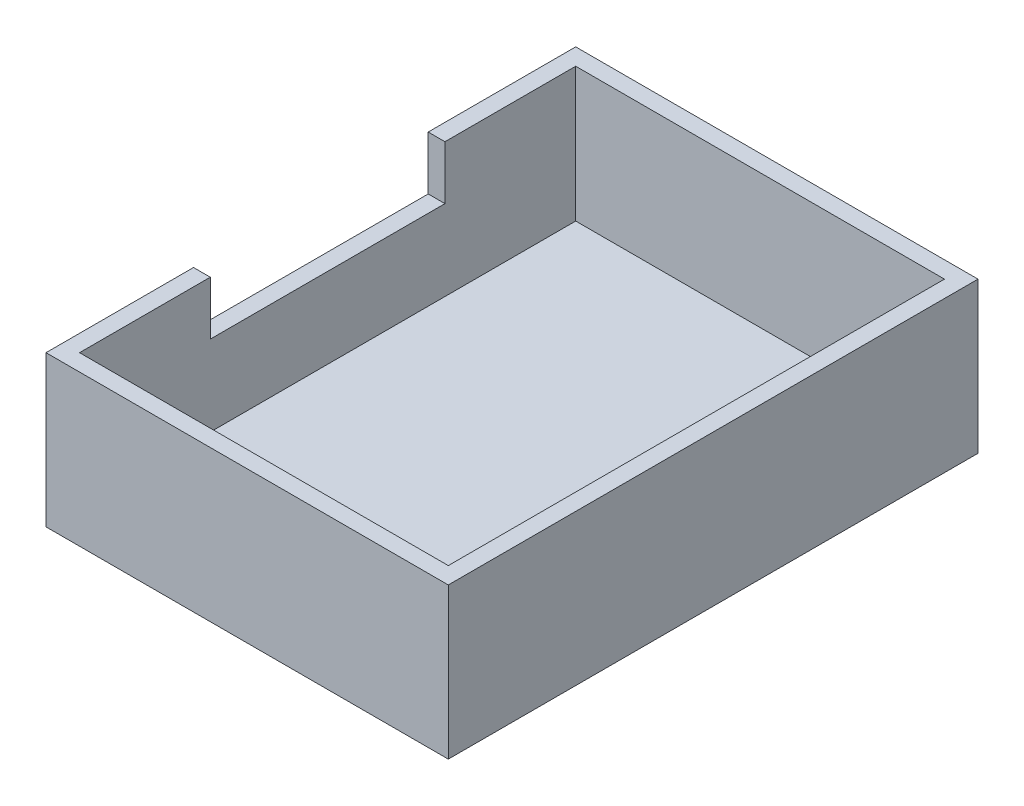
ISO-10303-21;
HEADER;
FILE_DESCRIPTION(('STEP AP214'),'2;1');
FILE_NAME('part.step','',(''),(''),'','','');
FILE_SCHEMA(('AUTOMOTIVE_DESIGN { 1 0 10303 214 1 1 1 1 }'));
ENDSEC;
DATA;
#1=APPLICATION_CONTEXT('core data for automotive mechanical design processes');
#2=APPLICATION_PROTOCOL_DEFINITION('international standard','automotive_design',2000,#1);
#3=PRODUCT_CONTEXT('',#1,'mechanical');
#4=PRODUCT('Part','Part','',(#3));
#5=PRODUCT_RELATED_PRODUCT_CATEGORY('part','',(#4));
#6=PRODUCT_DEFINITION_FORMATION('','',#4);
#7=PRODUCT_DEFINITION_CONTEXT('part definition',#1,'design');
#8=PRODUCT_DEFINITION('design','',#6,#7);
#9=PRODUCT_DEFINITION_SHAPE('','',#8);
#10=(LENGTH_UNIT() NAMED_UNIT(*) SI_UNIT(.MILLI.,.METRE.));
#11=(NAMED_UNIT(*) PLANE_ANGLE_UNIT() SI_UNIT($,.RADIAN.));
#12=(NAMED_UNIT(*) SI_UNIT($,.STERADIAN.) SOLID_ANGLE_UNIT());
#13=UNCERTAINTY_MEASURE_WITH_UNIT(LENGTH_MEASURE(1.E-05),#10,'distance_accuracy_value','');
#14=(GEOMETRIC_REPRESENTATION_CONTEXT(3) GLOBAL_UNCERTAINTY_ASSIGNED_CONTEXT((#13)) GLOBAL_UNIT_ASSIGNED_CONTEXT((#10,
#11,#12)) REPRESENTATION_CONTEXT('',''));
#15=CARTESIAN_POINT('',(0.,0.,0.));
#16=DIRECTION('',(0.,0.,1.));
#17=DIRECTION('',(1.,0.,0.));
#18=AXIS2_PLACEMENT_3D('',#15,#16,#17);
#19=CARTESIAN_POINT('',(0.,40.,0.));
#20=DIRECTION('',(0.,-1.,0.));
#21=DIRECTION('',(0.,0.,-1.));
#22=AXIS2_PLACEMENT_3D('',#19,#20,#21);
#23=PLANE('',#22);
#24=DIRECTION('',(0.,0.,1.));
#25=VECTOR('',#24,1.);
#26=CARTESIAN_POINT('',(-55.,40.,74.));
#27=LINE('',#26,#25);
#28=CARTESIAN_POINT('',(-55.,40.,35.));
#29=VERTEX_POINT('',#28);
#30=CARTESIAN_POINT('',(-55.,40.,74.));
#31=VERTEX_POINT('',#30);
#32=EDGE_CURVE('E71',#29,#31,#27,.T.);
#33=ORIENTED_EDGE('',*,*,#32,.F.);
#34=DIRECTION('',(1.,0.,0.));
#35=VECTOR('',#34,1.);
#36=CARTESIAN_POINT('',(-60.,40.,35.));
#37=LINE('',#36,#35);
#38=CARTESIAN_POINT('',(-60.,40.,35.));
#39=VERTEX_POINT('',#38);
#40=EDGE_CURVE('E136',#39,#29,#37,.T.);
#41=ORIENTED_EDGE('',*,*,#40,.F.);
#42=DIRECTION('',(0.,0.,1.));
#43=VECTOR('',#42,1.);
#44=CARTESIAN_POINT('',(-60.,40.,79.));
#45=LINE('',#44,#43);
#46=CARTESIAN_POINT('',(-60.,40.,79.));
#47=VERTEX_POINT('',#46);
#48=EDGE_CURVE('E200',#39,#47,#45,.T.);
#49=ORIENTED_EDGE('',*,*,#48,.T.);
#50=DIRECTION('',(1.,0.,0.));
#51=VECTOR('',#50,1.);
#52=CARTESIAN_POINT('',(-60.,40.,79.));
#53=LINE('',#52,#51);
#54=CARTESIAN_POINT('',(60.,40.,79.));
#55=VERTEX_POINT('',#54);
#56=EDGE_CURVE('E205',#47,#55,#53,.T.);
#57=ORIENTED_EDGE('',*,*,#56,.T.);
#58=DIRECTION('',(0.,0.,-1.));
#59=VECTOR('',#58,1.);
#60=CARTESIAN_POINT('',(60.,40.,79.));
#61=LINE('',#60,#59);
#62=CARTESIAN_POINT('',(60.,40.,-79.));
#63=VERTEX_POINT('',#62);
#64=EDGE_CURVE('E208',#55,#63,#61,.T.);
#65=ORIENTED_EDGE('',*,*,#64,.T.);
#66=DIRECTION('',(-1.,0.,0.));
#67=VECTOR('',#66,1.);
#68=CARTESIAN_POINT('',(-60.,40.,-79.));
#69=LINE('',#68,#67);
#70=CARTESIAN_POINT('',(-60.,40.,-79.));
#71=VERTEX_POINT('',#70);
#72=EDGE_CURVE('E211',#63,#71,#69,.T.);
#73=ORIENTED_EDGE('',*,*,#72,.T.);
#74=CARTESIAN_POINT('',(-60.,40.,-35.));
#75=VERTEX_POINT('',#74);
#76=EDGE_CURVE('E201',#71,#75,#45,.T.);
#77=ORIENTED_EDGE('',*,*,#76,.T.);
#78=DIRECTION('',(-1.,0.,0.));
#79=VECTOR('',#78,1.);
#80=CARTESIAN_POINT('',(-55.,40.,-35.));
#81=LINE('',#80,#79);
#82=CARTESIAN_POINT('',(-55.,40.,-35.));
#83=VERTEX_POINT('',#82);
#84=EDGE_CURVE('E143',#83,#75,#81,.T.);
#85=ORIENTED_EDGE('',*,*,#84,.F.);
#86=CARTESIAN_POINT('',(-55.,40.,-74.));
#87=VERTEX_POINT('',#86);
#88=EDGE_CURVE('E157',#87,#83,#27,.T.);
#89=ORIENTED_EDGE('',*,*,#88,.F.);
#90=DIRECTION('',(-1.,0.,0.));
#91=VECTOR('',#90,1.);
#92=CARTESIAN_POINT('',(-55.,40.,-74.));
#93=LINE('',#92,#91);
#94=CARTESIAN_POINT('',(55.,40.,-74.));
#95=VERTEX_POINT('',#94);
#96=EDGE_CURVE('E158',#95,#87,#93,.T.);
#97=ORIENTED_EDGE('',*,*,#96,.F.);
#98=DIRECTION('',(0.,0.,-1.));
#99=VECTOR('',#98,1.);
#100=CARTESIAN_POINT('',(55.,40.,74.));
#101=LINE('',#100,#99);
#102=CARTESIAN_POINT('',(55.,40.,74.));
#103=VERTEX_POINT('',#102);
#104=EDGE_CURVE('E163',#103,#95,#101,.T.);
#105=ORIENTED_EDGE('',*,*,#104,.F.);
#106=DIRECTION('',(1.,0.,0.));
#107=VECTOR('',#106,1.);
#108=CARTESIAN_POINT('',(-55.,40.,74.));
#109=LINE('',#108,#107);
#110=EDGE_CURVE('E155',#31,#103,#109,.T.);
#111=ORIENTED_EDGE('',*,*,#110,.F.);
#112=EDGE_LOOP('',(#33,#41,#49,#57,#65,#73,#77,#85,#89,#97,#105,#111));
#113=FACE_BOUND('',#112,.T.);
#114=ADVANCED_FACE('F48',(#113),#23,.F.);
#115=CARTESIAN_POINT('',(-60.,40.,79.));
#116=DIRECTION('',(1.,0.,0.));
#117=DIRECTION('',(0.,0.,-1.));
#118=AXIS2_PLACEMENT_3D('',#115,#116,#117);
#119=PLANE('',#118);
#120=ORIENTED_EDGE('',*,*,#48,.F.);
#121=DIRECTION('',(0.,1.,0.));
#122=VECTOR('',#121,1.);
#123=CARTESIAN_POINT('',(-60.,-70.178344238091,35.));
#124=LINE('',#123,#122);
#125=CARTESIAN_POINT('',(-60.,24.,35.));
#126=VERTEX_POINT('',#125);
#127=EDGE_CURVE('E139',#126,#39,#124,.T.);
#128=ORIENTED_EDGE('',*,*,#127,.F.);
#129=DIRECTION('',(0.,0.,-1.));
#130=VECTOR('',#129,1.);
#131=CARTESIAN_POINT('',(-60.,24.,-35.));
#132=LINE('',#131,#130);
#133=CARTESIAN_POINT('',(-60.,24.,-35.));
#134=VERTEX_POINT('',#133);
#135=EDGE_CURVE('E392',#126,#134,#132,.T.);
#136=ORIENTED_EDGE('',*,*,#135,.T.);
#137=DIRECTION('',(0.,1.,0.));
#138=VECTOR('',#137,1.);
#139=CARTESIAN_POINT('',(-60.,-70.178344238091,-35.));
#140=LINE('',#139,#138);
#141=EDGE_CURVE('E407',#134,#75,#140,.T.);
#142=ORIENTED_EDGE('',*,*,#141,.T.);
#143=ORIENTED_EDGE('',*,*,#76,.F.);
#144=DIRECTION('',(0.,-1.,0.));
#145=VECTOR('',#144,1.);
#146=CARTESIAN_POINT('',(-60.,40.,-79.));
#147=LINE('',#146,#145);
#148=CARTESIAN_POINT('',(-60.,-5.,-79.));
#149=VERTEX_POINT('',#148);
#150=EDGE_CURVE('E214',#71,#149,#147,.T.);
#151=ORIENTED_EDGE('',*,*,#150,.T.);
#152=DIRECTION('',(0.,0.,-1.));
#153=VECTOR('',#152,1.);
#154=CARTESIAN_POINT('',(-60.,-5.,-79.));
#155=LINE('',#154,#153);
#156=CARTESIAN_POINT('',(-60.,-5.,79.));
#157=VERTEX_POINT('',#156);
#158=EDGE_CURVE('E397',#157,#149,#155,.T.);
#159=ORIENTED_EDGE('',*,*,#158,.F.);
#160=DIRECTION('',(0.,-1.,0.));
#161=VECTOR('',#160,1.);
#162=CARTESIAN_POINT('',(-60.,40.,79.));
#163=LINE('',#162,#161);
#164=EDGE_CURVE('E13',#47,#157,#163,.T.);
#165=ORIENTED_EDGE('',*,*,#164,.F.);
#166=EDGE_LOOP('',(#120,#128,#136,#142,#143,#151,#159,#165));
#167=FACE_BOUND('',#166,.T.);
#168=ADVANCED_FACE('F50',(#167),#119,.F.);
#169=CARTESIAN_POINT('',(-60.,40.,79.));
#170=DIRECTION('',(0.,0.,-1.));
#171=DIRECTION('',(-1.,0.,0.));
#172=AXIS2_PLACEMENT_3D('',#169,#170,#171);
#173=PLANE('',#172);
#174=ORIENTED_EDGE('',*,*,#164,.T.);
#175=DIRECTION('',(-1.,0.,0.));
#176=VECTOR('',#175,1.);
#177=CARTESIAN_POINT('',(-60.,-5.,79.));
#178=LINE('',#177,#176);
#179=CARTESIAN_POINT('',(60.,-5.,79.));
#180=VERTEX_POINT('',#179);
#181=EDGE_CURVE('E175',#180,#157,#178,.T.);
#182=ORIENTED_EDGE('',*,*,#181,.F.);
#183=DIRECTION('',(0.,-1.,0.));
#184=VECTOR('',#183,1.);
#185=CARTESIAN_POINT('',(60.,40.,79.));
#186=LINE('',#185,#184);
#187=EDGE_CURVE('E57',#55,#180,#186,.T.);
#188=ORIENTED_EDGE('',*,*,#187,.F.);
#189=ORIENTED_EDGE('',*,*,#56,.F.);
#190=EDGE_LOOP('',(#174,#182,#188,#189));
#191=FACE_BOUND('',#190,.T.);
#192=ADVANCED_FACE('F241',(#191),#173,.F.);
#193=CARTESIAN_POINT('',(60.,40.,79.));
#194=DIRECTION('',(-1.,0.,0.));
#195=DIRECTION('',(0.,0.,1.));
#196=AXIS2_PLACEMENT_3D('',#193,#194,#195);
#197=PLANE('',#196);
#198=ORIENTED_EDGE('',*,*,#187,.T.);
#199=DIRECTION('',(0.,0.,1.));
#200=VECTOR('',#199,1.);
#201=CARTESIAN_POINT('',(60.,-5.,79.));
#202=LINE('',#201,#200);
#203=CARTESIAN_POINT('',(60.,-5.,-79.));
#204=VERTEX_POINT('',#203);
#205=EDGE_CURVE('E227',#204,#180,#202,.T.);
#206=ORIENTED_EDGE('',*,*,#205,.F.);
#207=DIRECTION('',(0.,-1.,0.));
#208=VECTOR('',#207,1.);
#209=CARTESIAN_POINT('',(60.,40.,-79.));
#210=LINE('',#209,#208);
#211=EDGE_CURVE('E217',#63,#204,#210,.T.);
#212=ORIENTED_EDGE('',*,*,#211,.F.);
#213=ORIENTED_EDGE('',*,*,#64,.F.);
#214=EDGE_LOOP('',(#198,#206,#212,#213));
#215=FACE_BOUND('',#214,.T.);
#216=ADVANCED_FACE('F225',(#215),#197,.F.);
#217=CARTESIAN_POINT('',(-60.,40.,-79.));
#218=DIRECTION('',(0.,0.,1.));
#219=DIRECTION('',(1.,0.,0.));
#220=AXIS2_PLACEMENT_3D('',#217,#218,#219);
#221=PLANE('',#220);
#222=ORIENTED_EDGE('',*,*,#211,.T.);
#223=DIRECTION('',(1.,0.,0.));
#224=VECTOR('',#223,1.);
#225=CARTESIAN_POINT('',(60.,-5.,-79.));
#226=LINE('',#225,#224);
#227=EDGE_CURVE('E238',#149,#204,#226,.T.);
#228=ORIENTED_EDGE('',*,*,#227,.F.);
#229=ORIENTED_EDGE('',*,*,#150,.F.);
#230=ORIENTED_EDGE('',*,*,#72,.F.);
#231=EDGE_LOOP('',(#222,#228,#229,#230));
#232=FACE_BOUND('',#231,.T.);
#233=ADVANCED_FACE('F281',(#232),#221,.F.);
#234=CARTESIAN_POINT('',(55.,40.,74.));
#235=DIRECTION('',(-1.,0.,0.));
#236=DIRECTION('',(0.,0.,1.));
#237=AXIS2_PLACEMENT_3D('',#234,#235,#236);
#238=PLANE('',#237);
#239=DIRECTION('',(0.,0.,-1.));
#240=VECTOR('',#239,1.);
#241=CARTESIAN_POINT('',(55.,0.,74.));
#242=LINE('',#241,#240);
#243=CARTESIAN_POINT('',(55.,0.,74.));
#244=VERTEX_POINT('',#243);
#245=CARTESIAN_POINT('',(55.,0.,-74.));
#246=VERTEX_POINT('',#245);
#247=EDGE_CURVE('E170',#244,#246,#242,.T.);
#248=ORIENTED_EDGE('',*,*,#247,.F.);
#249=DIRECTION('',(0.,-1.,0.));
#250=VECTOR('',#249,1.);
#251=CARTESIAN_POINT('',(55.,40.,74.));
#252=LINE('',#251,#250);
#253=EDGE_CURVE('E169',#103,#244,#252,.T.);
#254=ORIENTED_EDGE('',*,*,#253,.F.);
#255=ORIENTED_EDGE('',*,*,#104,.T.);
#256=DIRECTION('',(0.,-1.,0.));
#257=VECTOR('',#256,1.);
#258=CARTESIAN_POINT('',(55.,40.,-74.));
#259=LINE('',#258,#257);
#260=EDGE_CURVE('E196',#95,#246,#259,.T.);
#261=ORIENTED_EDGE('',*,*,#260,.T.);
#262=EDGE_LOOP('',(#248,#254,#255,#261));
#263=FACE_BOUND('',#262,.T.);
#264=ADVANCED_FACE('F250',(#263),#238,.T.);
#265=CARTESIAN_POINT('',(-55.,40.,-74.));
#266=DIRECTION('',(0.,0.,1.));
#267=DIRECTION('',(1.,0.,0.));
#268=AXIS2_PLACEMENT_3D('',#265,#266,#267);
#269=PLANE('',#268);
#270=DIRECTION('',(-1.,0.,0.));
#271=VECTOR('',#270,1.);
#272=CARTESIAN_POINT('',(-55.,0.,-74.));
#273=LINE('',#272,#271);
#274=CARTESIAN_POINT('',(-55.,0.,-74.));
#275=VERTEX_POINT('',#274);
#276=EDGE_CURVE('E174',#246,#275,#273,.T.);
#277=ORIENTED_EDGE('',*,*,#276,.F.);
#278=ORIENTED_EDGE('',*,*,#260,.F.);
#279=ORIENTED_EDGE('',*,*,#96,.T.);
#280=DIRECTION('',(0.,-1.,0.));
#281=VECTOR('',#280,1.);
#282=CARTESIAN_POINT('',(-55.,40.,-74.));
#283=LINE('',#282,#281);
#284=EDGE_CURVE('E193',#87,#275,#283,.T.);
#285=ORIENTED_EDGE('',*,*,#284,.T.);
#286=EDGE_LOOP('',(#277,#278,#279,#285));
#287=FACE_BOUND('',#286,.T.);
#288=ADVANCED_FACE('F253',(#287),#269,.T.);
#289=CARTESIAN_POINT('',(-55.,40.,74.));
#290=DIRECTION('',(1.,0.,0.));
#291=DIRECTION('',(0.,0.,-1.));
#292=AXIS2_PLACEMENT_3D('',#289,#290,#291);
#293=PLANE('',#292);
#294=DIRECTION('',(0.,1.,0.));
#295=VECTOR('',#294,1.);
#296=CARTESIAN_POINT('',(-55.,-70.178344238091,35.));
#297=LINE('',#296,#295);
#298=CARTESIAN_POINT('',(-55.,24.,35.));
#299=VERTEX_POINT('',#298);
#300=EDGE_CURVE('E64',#299,#29,#297,.T.);
#301=ORIENTED_EDGE('',*,*,#300,.T.);
#302=ORIENTED_EDGE('',*,*,#32,.T.);
#303=DIRECTION('',(0.,-1.,0.));
#304=VECTOR('',#303,1.);
#305=CARTESIAN_POINT('',(-55.,40.,74.));
#306=LINE('',#305,#304);
#307=CARTESIAN_POINT('',(-55.,0.,74.));
#308=VERTEX_POINT('',#307);
#309=EDGE_CURVE('E190',#31,#308,#306,.T.);
#310=ORIENTED_EDGE('',*,*,#309,.T.);
#311=DIRECTION('',(0.,0.,1.));
#312=VECTOR('',#311,1.);
#313=CARTESIAN_POINT('',(-55.,0.,74.));
#314=LINE('',#313,#312);
#315=EDGE_CURVE('E179',#275,#308,#314,.T.);
#316=ORIENTED_EDGE('',*,*,#315,.F.);
#317=ORIENTED_EDGE('',*,*,#284,.F.);
#318=ORIENTED_EDGE('',*,*,#88,.T.);
#319=DIRECTION('',(0.,1.,0.));
#320=VECTOR('',#319,1.);
#321=CARTESIAN_POINT('',(-55.,-70.178344238091,-35.));
#322=LINE('',#321,#320);
#323=CARTESIAN_POINT('',(-55.,24.,-35.));
#324=VERTEX_POINT('',#323);
#325=EDGE_CURVE('E151',#324,#83,#322,.T.);
#326=ORIENTED_EDGE('',*,*,#325,.F.);
#327=DIRECTION('',(0.,0.,1.));
#328=VECTOR('',#327,1.);
#329=CARTESIAN_POINT('',(-55.,24.,35.));
#330=LINE('',#329,#328);
#331=EDGE_CURVE('E149',#324,#299,#330,.T.);
#332=ORIENTED_EDGE('',*,*,#331,.T.);
#333=EDGE_LOOP('',(#301,#302,#310,#316,#317,#318,#326,#332));
#334=FACE_BOUND('',#333,.T.);
#335=ADVANCED_FACE('F146',(#334),#293,.T.);
#336=CARTESIAN_POINT('',(-55.,40.,74.));
#337=DIRECTION('',(0.,0.,-1.));
#338=DIRECTION('',(-1.,0.,0.));
#339=AXIS2_PLACEMENT_3D('',#336,#337,#338);
#340=PLANE('',#339);
#341=DIRECTION('',(1.,0.,0.));
#342=VECTOR('',#341,1.);
#343=CARTESIAN_POINT('',(-55.,0.,74.));
#344=LINE('',#343,#342);
#345=EDGE_CURVE('E183',#308,#244,#344,.T.);
#346=ORIENTED_EDGE('',*,*,#345,.F.);
#347=ORIENTED_EDGE('',*,*,#309,.F.);
#348=ORIENTED_EDGE('',*,*,#110,.T.);
#349=ORIENTED_EDGE('',*,*,#253,.T.);
#350=EDGE_LOOP('',(#346,#347,#348,#349));
#351=FACE_BOUND('',#350,.T.);
#352=ADVANCED_FACE('F261',(#351),#340,.T.);
#353=CARTESIAN_POINT('',(0.,0.,0.));
#354=DIRECTION('',(0.,1.,0.));
#355=DIRECTION('',(0.,0.,1.));
#356=AXIS2_PLACEMENT_3D('',#353,#354,#355);
#357=PLANE('',#356);
#358=ORIENTED_EDGE('',*,*,#315,.T.);
#359=ORIENTED_EDGE('',*,*,#345,.T.);
#360=ORIENTED_EDGE('',*,*,#247,.T.);
#361=ORIENTED_EDGE('',*,*,#276,.T.);
#362=EDGE_LOOP('',(#358,#359,#360,#361));
#363=FACE_BOUND('',#362,.T.);
#364=ADVANCED_FACE('F259',(#363),#357,.T.);
#365=CARTESIAN_POINT('',(0.,-5.,0.));
#366=DIRECTION('',(0.,1.,0.));
#367=DIRECTION('',(0.,0.,1.));
#368=AXIS2_PLACEMENT_3D('',#365,#366,#367);
#369=PLANE('',#368);
#370=ORIENTED_EDGE('',*,*,#158,.T.);
#371=ORIENTED_EDGE('',*,*,#227,.T.);
#372=ORIENTED_EDGE('',*,*,#205,.T.);
#373=ORIENTED_EDGE('',*,*,#181,.T.);
#374=EDGE_LOOP('',(#370,#371,#372,#373));
#375=FACE_BOUND('',#374,.T.);
#376=ADVANCED_FACE('F235',(#375),#369,.F.);
#377=CARTESIAN_POINT('',(-60.,-70.178344238091,35.));
#378=DIRECTION('',(0.,0.,1.));
#379=DIRECTION('',(1.,0.,0.));
#380=AXIS2_PLACEMENT_3D('',#377,#378,#379);
#381=PLANE('',#380);
#382=DIRECTION('',(-1.,0.,0.));
#383=VECTOR('',#382,1.);
#384=CARTESIAN_POINT('',(-60.,24.,35.));
#385=LINE('',#384,#383);
#386=EDGE_CURVE('E390',#299,#126,#385,.T.);
#387=ORIENTED_EDGE('',*,*,#386,.T.);
#388=ORIENTED_EDGE('',*,*,#127,.T.);
#389=ORIENTED_EDGE('',*,*,#40,.T.);
#390=ORIENTED_EDGE('',*,*,#300,.F.);
#391=EDGE_LOOP('',(#387,#388,#389,#390));
#392=FACE_BOUND('',#391,.T.);
#393=ADVANCED_FACE('F137',(#392),#381,.F.);
#394=CARTESIAN_POINT('',(-55.,-70.178344238091,-35.));
#395=DIRECTION('',(0.,0.,-1.));
#396=DIRECTION('',(-1.,0.,0.));
#397=AXIS2_PLACEMENT_3D('',#394,#395,#396);
#398=PLANE('',#397);
#399=DIRECTION('',(1.,0.,0.));
#400=VECTOR('',#399,1.);
#401=CARTESIAN_POINT('',(-55.,24.,-35.));
#402=LINE('',#401,#400);
#403=EDGE_CURVE('E399',#134,#324,#402,.T.);
#404=ORIENTED_EDGE('',*,*,#403,.T.);
#405=ORIENTED_EDGE('',*,*,#325,.T.);
#406=ORIENTED_EDGE('',*,*,#84,.T.);
#407=ORIENTED_EDGE('',*,*,#141,.F.);
#408=EDGE_LOOP('',(#404,#405,#406,#407));
#409=FACE_BOUND('',#408,.T.);
#410=ADVANCED_FACE('F366',(#409),#398,.F.);
#411=CARTESIAN_POINT('',(0.,24.,0.));
#412=DIRECTION('',(0.,1.,0.));
#413=DIRECTION('',(0.,0.,1.));
#414=AXIS2_PLACEMENT_3D('',#411,#412,#413);
#415=PLANE('',#414);
#416=ORIENTED_EDGE('',*,*,#386,.F.);
#417=ORIENTED_EDGE('',*,*,#331,.F.);
#418=ORIENTED_EDGE('',*,*,#403,.F.);
#419=ORIENTED_EDGE('',*,*,#135,.F.);
#420=EDGE_LOOP('',(#416,#417,#418,#419));
#421=FACE_BOUND('',#420,.T.);
#422=ADVANCED_FACE('F374',(#421),#415,.T.);
#423=CLOSED_SHELL('',(#114,#168,#192,#216,#233,#264,#288,#335,#352,#364,#376,#393,#410,#422));
#424=MANIFOLD_SOLID_BREP('B2',#423);
#425=ADVANCED_BREP_SHAPE_REPRESENTATION('',(#18,#424),#14);
#426=SHAPE_DEFINITION_REPRESENTATION(#9,#425);
ENDSEC;
END-ISO-10303-21;
